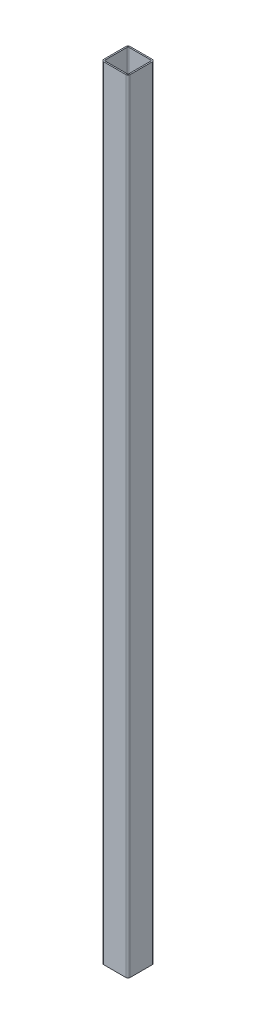
ISO-10303-21;
HEADER;
FILE_DESCRIPTION(('STEP AP214'),'2;1');
FILE_NAME('part.step','',(''),(''),'','','');
FILE_SCHEMA(('AUTOMOTIVE_DESIGN { 1 0 10303 214 1 1 1 1 }'));
ENDSEC;
DATA;
#1=APPLICATION_CONTEXT('core data for automotive mechanical design processes');
#2=APPLICATION_PROTOCOL_DEFINITION('international standard','automotive_design',2000,#1);
#3=PRODUCT_CONTEXT('',#1,'mechanical');
#4=PRODUCT('Part','Part','',(#3));
#5=PRODUCT_RELATED_PRODUCT_CATEGORY('part','',(#4));
#6=PRODUCT_DEFINITION_FORMATION('','',#4);
#7=PRODUCT_DEFINITION_CONTEXT('part definition',#1,'design');
#8=PRODUCT_DEFINITION('design','',#6,#7);
#9=PRODUCT_DEFINITION_SHAPE('','',#8);
#10=(LENGTH_UNIT() NAMED_UNIT(*) SI_UNIT(.MILLI.,.METRE.));
#11=(NAMED_UNIT(*) PLANE_ANGLE_UNIT() SI_UNIT($,.RADIAN.));
#12=(NAMED_UNIT(*) SI_UNIT($,.STERADIAN.) SOLID_ANGLE_UNIT());
#13=UNCERTAINTY_MEASURE_WITH_UNIT(LENGTH_MEASURE(1.E-05),#10,'distance_accuracy_value','');
#14=(GEOMETRIC_REPRESENTATION_CONTEXT(3) GLOBAL_UNCERTAINTY_ASSIGNED_CONTEXT((#13)) GLOBAL_UNIT_ASSIGNED_CONTEXT((#10,
#11,#12)) REPRESENTATION_CONTEXT('',''));
#15=CARTESIAN_POINT('',(0.,0.,0.));
#16=DIRECTION('',(0.,0.,1.));
#17=DIRECTION('',(1.,0.,0.));
#18=AXIS2_PLACEMENT_3D('',#15,#16,#17);
#19=CARTESIAN_POINT('',(25.,-1143.,25.));
#20=DIRECTION('',(0.,1.,0.));
#21=DIRECTION('',(0.,0.,1.));
#22=AXIS2_PLACEMENT_3D('',#19,#20,#21);
#23=CYLINDRICAL_SURFACE('',#22,5.);
#24=DIRECTION('',(0.,1.,0.));
#25=VECTOR('',#24,1.);
#26=CARTESIAN_POINT('',(30.,-1143.,25.));
#27=LINE('',#26,#25);
#28=CARTESIAN_POINT('',(30.,-1143.,25.));
#29=VERTEX_POINT('',#28);
#30=CARTESIAN_POINT('',(30.,630.,25.));
#31=VERTEX_POINT('',#30);
#32=EDGE_CURVE('E132',#29,#31,#27,.T.);
#33=ORIENTED_EDGE('',*,*,#32,.T.);
#34=CARTESIAN_POINT('',(25.,630.,25.));
#35=DIRECTION('',(0.,1.,0.));
#36=DIRECTION('',(0.,0.,-1.));
#37=AXIS2_PLACEMENT_3D('',#34,#35,#36);
#38=CIRCLE('',#37,5.);
#39=CARTESIAN_POINT('',(25.,630.,30.));
#40=VERTEX_POINT('',#39);
#41=EDGE_CURVE('E285',#40,#31,#38,.T.);
#42=ORIENTED_EDGE('',*,*,#41,.F.);
#43=DIRECTION('',(0.,1.,0.));
#44=VECTOR('',#43,1.);
#45=CARTESIAN_POINT('',(25.,-1143.,30.));
#46=LINE('',#45,#44);
#47=CARTESIAN_POINT('',(25.,-1143.,30.));
#48=VERTEX_POINT('',#47);
#49=EDGE_CURVE('E12',#48,#40,#46,.T.);
#50=ORIENTED_EDGE('',*,*,#49,.F.);
#51=CARTESIAN_POINT('',(25.,-1143.,25.));
#52=DIRECTION('',(0.,1.,0.));
#53=DIRECTION('',(0.,0.,-1.));
#54=AXIS2_PLACEMENT_3D('',#51,#52,#53);
#55=CIRCLE('',#54,5.);
#56=EDGE_CURVE('E328',#48,#29,#55,.T.);
#57=ORIENTED_EDGE('',*,*,#56,.T.);
#58=EDGE_LOOP('',(#33,#42,#50,#57));
#59=FACE_BOUND('',#58,.T.);
#60=ADVANCED_FACE('F129',(#59),#23,.T.);
#61=CARTESIAN_POINT('',(-25.,-1143.,30.));
#62=DIRECTION('',(0.,0.,1.));
#63=DIRECTION('',(1.,0.,0.));
#64=AXIS2_PLACEMENT_3D('',#61,#62,#63);
#65=PLANE('',#64);
#66=ORIENTED_EDGE('',*,*,#49,.T.);
#67=DIRECTION('',(1.,0.,0.));
#68=VECTOR('',#67,1.);
#69=CARTESIAN_POINT('',(-25.,630.,30.));
#70=LINE('',#69,#68);
#71=CARTESIAN_POINT('',(-25.,630.,30.));
#72=VERTEX_POINT('',#71);
#73=EDGE_CURVE('E306',#72,#40,#70,.T.);
#74=ORIENTED_EDGE('',*,*,#73,.F.);
#75=DIRECTION('',(0.,1.,0.));
#76=VECTOR('',#75,1.);
#77=CARTESIAN_POINT('',(-25.,-1143.,30.));
#78=LINE('',#77,#76);
#79=CARTESIAN_POINT('',(-25.,-1143.,30.));
#80=VERTEX_POINT('',#79);
#81=EDGE_CURVE('E137',#80,#72,#78,.T.);
#82=ORIENTED_EDGE('',*,*,#81,.F.);
#83=DIRECTION('',(1.,0.,0.));
#84=VECTOR('',#83,1.);
#85=CARTESIAN_POINT('',(-25.,-1143.,30.));
#86=LINE('',#85,#84);
#87=EDGE_CURVE('E359',#80,#48,#86,.T.);
#88=ORIENTED_EDGE('',*,*,#87,.T.);
#89=EDGE_LOOP('',(#66,#74,#82,#88));
#90=FACE_BOUND('',#89,.T.);
#91=ADVANCED_FACE('F380',(#90),#65,.T.);
#92=CARTESIAN_POINT('',(-25.,-1143.,25.));
#93=DIRECTION('',(0.,1.,0.));
#94=DIRECTION('',(0.,0.,1.));
#95=AXIS2_PLACEMENT_3D('',#92,#93,#94);
#96=CYLINDRICAL_SURFACE('',#95,5.00000000000001);
#97=ORIENTED_EDGE('',*,*,#81,.T.);
#98=CARTESIAN_POINT('',(-25.,630.,25.));
#99=DIRECTION('',(0.,1.,0.));
#100=DIRECTION('',(0.,0.,-1.));
#101=AXIS2_PLACEMENT_3D('',#98,#99,#100);
#102=CIRCLE('',#101,5.00000000000001);
#103=CARTESIAN_POINT('',(-30.,630.,25.));
#104=VERTEX_POINT('',#103);
#105=EDGE_CURVE('E303',#104,#72,#102,.T.);
#106=ORIENTED_EDGE('',*,*,#105,.F.);
#107=DIRECTION('',(0.,1.,0.));
#108=VECTOR('',#107,1.);
#109=CARTESIAN_POINT('',(-30.,-1143.,25.));
#110=LINE('',#109,#108);
#111=CARTESIAN_POINT('',(-30.,-1143.,25.));
#112=VERTEX_POINT('',#111);
#113=EDGE_CURVE('E363',#112,#104,#110,.T.);
#114=ORIENTED_EDGE('',*,*,#113,.F.);
#115=CARTESIAN_POINT('',(-25.,-1143.,25.));
#116=DIRECTION('',(0.,1.,0.));
#117=DIRECTION('',(0.,0.,-1.));
#118=AXIS2_PLACEMENT_3D('',#115,#116,#117);
#119=CIRCLE('',#118,5.00000000000001);
#120=EDGE_CURVE('E356',#112,#80,#119,.T.);
#121=ORIENTED_EDGE('',*,*,#120,.T.);
#122=EDGE_LOOP('',(#97,#106,#114,#121));
#123=FACE_BOUND('',#122,.T.);
#124=ADVANCED_FACE('F401',(#123),#96,.T.);
#125=CARTESIAN_POINT('',(-30.,-1143.,-25.));
#126=DIRECTION('',(-1.,0.,0.));
#127=DIRECTION('',(0.,0.,1.));
#128=AXIS2_PLACEMENT_3D('',#125,#126,#127);
#129=PLANE('',#128);
#130=ORIENTED_EDGE('',*,*,#113,.T.);
#131=DIRECTION('',(0.,0.,1.));
#132=VECTOR('',#131,1.);
#133=CARTESIAN_POINT('',(-30.,630.,-25.));
#134=LINE('',#133,#132);
#135=CARTESIAN_POINT('',(-30.,630.,-25.));
#136=VERTEX_POINT('',#135);
#137=EDGE_CURVE('E300',#136,#104,#134,.T.);
#138=ORIENTED_EDGE('',*,*,#137,.F.);
#139=DIRECTION('',(0.,1.,0.));
#140=VECTOR('',#139,1.);
#141=CARTESIAN_POINT('',(-30.,-1143.,-25.));
#142=LINE('',#141,#140);
#143=CARTESIAN_POINT('',(-30.,-1143.,-25.));
#144=VERTEX_POINT('',#143);
#145=EDGE_CURVE('E365',#144,#136,#142,.T.);
#146=ORIENTED_EDGE('',*,*,#145,.F.);
#147=DIRECTION('',(0.,0.,1.));
#148=VECTOR('',#147,1.);
#149=CARTESIAN_POINT('',(-30.,-1143.,-25.));
#150=LINE('',#149,#148);
#151=EDGE_CURVE('E353',#144,#112,#150,.T.);
#152=ORIENTED_EDGE('',*,*,#151,.T.);
#153=EDGE_LOOP('',(#130,#138,#146,#152));
#154=FACE_BOUND('',#153,.T.);
#155=ADVANCED_FACE('F398',(#154),#129,.T.);
#156=CARTESIAN_POINT('',(-25.,-1143.,-25.));
#157=DIRECTION('',(0.,1.,0.));
#158=DIRECTION('',(0.,0.,1.));
#159=AXIS2_PLACEMENT_3D('',#156,#157,#158);
#160=CYLINDRICAL_SURFACE('',#159,5.);
#161=ORIENTED_EDGE('',*,*,#145,.T.);
#162=CARTESIAN_POINT('',(-25.,630.,-25.));
#163=DIRECTION('',(0.,1.,0.));
#164=DIRECTION('',(0.,0.,1.));
#165=AXIS2_PLACEMENT_3D('',#162,#163,#164);
#166=CIRCLE('',#165,5.);
#167=CARTESIAN_POINT('',(-25.,630.,-30.));
#168=VERTEX_POINT('',#167);
#169=EDGE_CURVE('E297',#168,#136,#166,.T.);
#170=ORIENTED_EDGE('',*,*,#169,.F.);
#171=DIRECTION('',(0.,1.,0.));
#172=VECTOR('',#171,1.);
#173=CARTESIAN_POINT('',(-25.,-1143.,-30.));
#174=LINE('',#173,#172);
#175=CARTESIAN_POINT('',(-25.,-1143.,-30.));
#176=VERTEX_POINT('',#175);
#177=EDGE_CURVE('E367',#176,#168,#174,.T.);
#178=ORIENTED_EDGE('',*,*,#177,.F.);
#179=CARTESIAN_POINT('',(-25.,-1143.,-25.));
#180=DIRECTION('',(0.,1.,0.));
#181=DIRECTION('',(0.,0.,1.));
#182=AXIS2_PLACEMENT_3D('',#179,#180,#181);
#183=CIRCLE('',#182,5.);
#184=EDGE_CURVE('E350',#176,#144,#183,.T.);
#185=ORIENTED_EDGE('',*,*,#184,.T.);
#186=EDGE_LOOP('',(#161,#170,#178,#185));
#187=FACE_BOUND('',#186,.T.);
#188=ADVANCED_FACE('F396',(#187),#160,.T.);
#189=CARTESIAN_POINT('',(-25.,-1143.,-30.));
#190=DIRECTION('',(0.,0.,-1.));
#191=DIRECTION('',(-1.,0.,0.));
#192=AXIS2_PLACEMENT_3D('',#189,#190,#191);
#193=PLANE('',#192);
#194=ORIENTED_EDGE('',*,*,#177,.T.);
#195=DIRECTION('',(-1.,0.,0.));
#196=VECTOR('',#195,1.);
#197=CARTESIAN_POINT('',(-25.,630.,-30.));
#198=LINE('',#197,#196);
#199=CARTESIAN_POINT('',(25.,630.,-30.));
#200=VERTEX_POINT('',#199);
#201=EDGE_CURVE('E294',#200,#168,#198,.T.);
#202=ORIENTED_EDGE('',*,*,#201,.F.);
#203=DIRECTION('',(0.,1.,0.));
#204=VECTOR('',#203,1.);
#205=CARTESIAN_POINT('',(25.,-1143.,-30.));
#206=LINE('',#205,#204);
#207=CARTESIAN_POINT('',(25.,-1143.,-30.));
#208=VERTEX_POINT('',#207);
#209=EDGE_CURVE('E369',#208,#200,#206,.T.);
#210=ORIENTED_EDGE('',*,*,#209,.F.);
#211=DIRECTION('',(-1.,0.,0.));
#212=VECTOR('',#211,1.);
#213=CARTESIAN_POINT('',(-25.,-1143.,-30.));
#214=LINE('',#213,#212);
#215=EDGE_CURVE('E347',#208,#176,#214,.T.);
#216=ORIENTED_EDGE('',*,*,#215,.T.);
#217=EDGE_LOOP('',(#194,#202,#210,#216));
#218=FACE_BOUND('',#217,.T.);
#219=ADVANCED_FACE('F394',(#218),#193,.T.);
#220=CARTESIAN_POINT('',(25.,-1143.,-25.));
#221=DIRECTION('',(0.,1.,0.));
#222=DIRECTION('',(0.,0.,1.));
#223=AXIS2_PLACEMENT_3D('',#220,#221,#222);
#224=CYLINDRICAL_SURFACE('',#223,5.);
#225=ORIENTED_EDGE('',*,*,#209,.T.);
#226=CARTESIAN_POINT('',(25.,630.,-25.));
#227=DIRECTION('',(0.,1.,0.));
#228=DIRECTION('',(0.,0.,-1.));
#229=AXIS2_PLACEMENT_3D('',#226,#227,#228);
#230=CIRCLE('',#229,5.);
#231=CARTESIAN_POINT('',(30.,630.,-25.));
#232=VERTEX_POINT('',#231);
#233=EDGE_CURVE('E291',#232,#200,#230,.T.);
#234=ORIENTED_EDGE('',*,*,#233,.F.);
#235=DIRECTION('',(0.,1.,0.));
#236=VECTOR('',#235,1.);
#237=CARTESIAN_POINT('',(30.,-1143.,-25.));
#238=LINE('',#237,#236);
#239=CARTESIAN_POINT('',(30.,-1143.,-25.));
#240=VERTEX_POINT('',#239);
#241=EDGE_CURVE('E370',#240,#232,#238,.T.);
#242=ORIENTED_EDGE('',*,*,#241,.F.);
#243=CARTESIAN_POINT('',(25.,-1143.,-25.));
#244=DIRECTION('',(0.,1.,0.));
#245=DIRECTION('',(0.,0.,-1.));
#246=AXIS2_PLACEMENT_3D('',#243,#244,#245);
#247=CIRCLE('',#246,5.);
#248=EDGE_CURVE('E344',#240,#208,#247,.T.);
#249=ORIENTED_EDGE('',*,*,#248,.T.);
#250=EDGE_LOOP('',(#225,#234,#242,#249));
#251=FACE_BOUND('',#250,.T.);
#252=ADVANCED_FACE('F390',(#251),#224,.T.);
#253=CARTESIAN_POINT('',(30.,-1143.,-25.));
#254=DIRECTION('',(1.,0.,0.));
#255=DIRECTION('',(0.,0.,-1.));
#256=AXIS2_PLACEMENT_3D('',#253,#254,#255);
#257=PLANE('',#256);
#258=ORIENTED_EDGE('',*,*,#241,.T.);
#259=DIRECTION('',(0.,0.,-1.));
#260=VECTOR('',#259,1.);
#261=CARTESIAN_POINT('',(30.,630.,-25.));
#262=LINE('',#261,#260);
#263=EDGE_CURVE('E288',#31,#232,#262,.T.);
#264=ORIENTED_EDGE('',*,*,#263,.F.);
#265=ORIENTED_EDGE('',*,*,#32,.F.);
#266=DIRECTION('',(0.,0.,-1.));
#267=VECTOR('',#266,1.);
#268=CARTESIAN_POINT('',(30.,-1143.,-25.));
#269=LINE('',#268,#267);
#270=EDGE_CURVE('E341',#29,#240,#269,.T.);
#271=ORIENTED_EDGE('',*,*,#270,.T.);
#272=EDGE_LOOP('',(#258,#264,#265,#271));
#273=FACE_BOUND('',#272,.T.);
#274=ADVANCED_FACE('F374',(#273),#257,.T.);
#275=CARTESIAN_POINT('',(25.,-1143.,25.));
#276=DIRECTION('',(0.,1.,0.));
#277=DIRECTION('',(0.,0.,1.));
#278=AXIS2_PLACEMENT_3D('',#275,#276,#277);
#279=PLANE('',#278);
#280=DIRECTION('',(1.,0.,0.));
#281=VECTOR('',#280,1.);
#282=CARTESIAN_POINT('',(25.,-1143.,27.));
#283=LINE('',#282,#281);
#284=CARTESIAN_POINT('',(-25.,-1143.,27.));
#285=VERTEX_POINT('',#284);
#286=CARTESIAN_POINT('',(25.,-1143.,27.));
#287=VERTEX_POINT('',#286);
#288=EDGE_CURVE('E254',#285,#287,#283,.T.);
#289=ORIENTED_EDGE('',*,*,#288,.T.);
#290=CARTESIAN_POINT('',(25.,-1143.,25.));
#291=DIRECTION('',(0.,-1.,0.));
#292=DIRECTION('',(-1.,0.,0.));
#293=AXIS2_PLACEMENT_3D('',#290,#291,#292);
#294=CIRCLE('',#293,2.);
#295=CARTESIAN_POINT('',(27.,-1143.,25.));
#296=VERTEX_POINT('',#295);
#297=EDGE_CURVE('E309',#287,#296,#294,.F.);
#298=ORIENTED_EDGE('',*,*,#297,.T.);
#299=DIRECTION('',(0.,0.,-1.));
#300=VECTOR('',#299,1.);
#301=CARTESIAN_POINT('',(27.,-1143.,25.));
#302=LINE('',#301,#300);
#303=CARTESIAN_POINT('',(27.,-1143.,-25.));
#304=VERTEX_POINT('',#303);
#305=EDGE_CURVE('E249',#296,#304,#302,.T.);
#306=ORIENTED_EDGE('',*,*,#305,.T.);
#307=CARTESIAN_POINT('',(25.,-1143.,-25.));
#308=DIRECTION('',(0.,-1.,0.));
#309=DIRECTION('',(-1.,0.,0.));
#310=AXIS2_PLACEMENT_3D('',#307,#308,#309);
#311=CIRCLE('',#310,2.);
#312=CARTESIAN_POINT('',(25.,-1143.,-27.));
#313=VERTEX_POINT('',#312);
#314=EDGE_CURVE('E145',#304,#313,#311,.F.);
#315=ORIENTED_EDGE('',*,*,#314,.T.);
#316=DIRECTION('',(-1.,0.,0.));
#317=VECTOR('',#316,1.);
#318=CARTESIAN_POINT('',(25.,-1143.,-27.));
#319=LINE('',#318,#317);
#320=CARTESIAN_POINT('',(-25.,-1143.,-27.));
#321=VERTEX_POINT('',#320);
#322=EDGE_CURVE('E313',#313,#321,#319,.T.);
#323=ORIENTED_EDGE('',*,*,#322,.T.);
#324=CARTESIAN_POINT('',(-25.,-1143.,-25.));
#325=DIRECTION('',(0.,-1.,0.));
#326=DIRECTION('',(-1.,0.,0.));
#327=AXIS2_PLACEMENT_3D('',#324,#325,#326);
#328=CIRCLE('',#327,2.);
#329=CARTESIAN_POINT('',(-27.,-1143.,-25.));
#330=VERTEX_POINT('',#329);
#331=EDGE_CURVE('E316',#321,#330,#328,.F.);
#332=ORIENTED_EDGE('',*,*,#331,.T.);
#333=DIRECTION('',(0.,0.,1.));
#334=VECTOR('',#333,1.);
#335=CARTESIAN_POINT('',(-27.,-1143.,25.));
#336=LINE('',#335,#334);
#337=CARTESIAN_POINT('',(-27.,-1143.,25.));
#338=VERTEX_POINT('',#337);
#339=EDGE_CURVE('E319',#330,#338,#336,.T.);
#340=ORIENTED_EDGE('',*,*,#339,.T.);
#341=CARTESIAN_POINT('',(-25.,-1143.,25.));
#342=DIRECTION('',(0.,-1.,0.));
#343=DIRECTION('',(-1.,0.,0.));
#344=AXIS2_PLACEMENT_3D('',#341,#342,#343);
#345=CIRCLE('',#344,2.00000000000001);
#346=EDGE_CURVE('E322',#338,#285,#345,.F.);
#347=ORIENTED_EDGE('',*,*,#346,.T.);
#348=EDGE_LOOP('',(#289,#298,#306,#315,#323,#332,#340,#347));
#349=FACE_BOUND('',#348,.T.);
#350=ORIENTED_EDGE('',*,*,#56,.F.);
#351=ORIENTED_EDGE('',*,*,#87,.F.);
#352=ORIENTED_EDGE('',*,*,#120,.F.);
#353=ORIENTED_EDGE('',*,*,#151,.F.);
#354=ORIENTED_EDGE('',*,*,#184,.F.);
#355=ORIENTED_EDGE('',*,*,#215,.F.);
#356=ORIENTED_EDGE('',*,*,#248,.F.);
#357=ORIENTED_EDGE('',*,*,#270,.F.);
#358=EDGE_LOOP('',(#350,#351,#352,#353,#354,#355,#356,#357));
#359=FACE_BOUND('',#358,.T.);
#360=ADVANCED_FACE('F384',(#349,#359),#279,.F.);
#361=CARTESIAN_POINT('',(25.,-1143.,25.));
#362=DIRECTION('',(0.,1.,0.));
#363=DIRECTION('',(0.,0.,1.));
#364=AXIS2_PLACEMENT_3D('',#361,#362,#363);
#365=CYLINDRICAL_SURFACE('',#364,2.);
#366=DIRECTION('',(0.,1.,0.));
#367=VECTOR('',#366,1.);
#368=CARTESIAN_POINT('',(25.,-1143.,27.));
#369=LINE('',#368,#367);
#370=CARTESIAN_POINT('',(25.,630.,27.));
#371=VERTEX_POINT('',#370);
#372=EDGE_CURVE('E259',#287,#371,#369,.T.);
#373=ORIENTED_EDGE('',*,*,#372,.T.);
#374=CARTESIAN_POINT('',(25.,630.,25.));
#375=DIRECTION('',(0.,-1.,0.));
#376=DIRECTION('',(-1.,0.,0.));
#377=AXIS2_PLACEMENT_3D('',#374,#375,#376);
#378=CIRCLE('',#377,2.);
#379=CARTESIAN_POINT('',(27.,630.,25.));
#380=VERTEX_POINT('',#379);
#381=EDGE_CURVE('E257',#371,#380,#378,.F.);
#382=ORIENTED_EDGE('',*,*,#381,.T.);
#383=DIRECTION('',(0.,1.,0.));
#384=VECTOR('',#383,1.);
#385=CARTESIAN_POINT('',(27.,-1143.,25.));
#386=LINE('',#385,#384);
#387=EDGE_CURVE('E242',#296,#380,#386,.T.);
#388=ORIENTED_EDGE('',*,*,#387,.F.);
#389=ORIENTED_EDGE('',*,*,#297,.F.);
#390=EDGE_LOOP('',(#373,#382,#388,#389));
#391=FACE_BOUND('',#390,.T.);
#392=ADVANCED_FACE('F258',(#391),#365,.F.);
#393=CARTESIAN_POINT('',(25.,-1143.,27.));
#394=DIRECTION('',(0.,0.,1.));
#395=DIRECTION('',(1.,0.,0.));
#396=AXIS2_PLACEMENT_3D('',#393,#394,#395);
#397=PLANE('',#396);
#398=DIRECTION('',(0.,1.,0.));
#399=VECTOR('',#398,1.);
#400=CARTESIAN_POINT('',(-25.,-1143.,27.));
#401=LINE('',#400,#399);
#402=CARTESIAN_POINT('',(-25.,630.,27.));
#403=VERTEX_POINT('',#402);
#404=EDGE_CURVE('E329',#285,#403,#401,.T.);
#405=ORIENTED_EDGE('',*,*,#404,.T.);
#406=DIRECTION('',(1.,0.,0.));
#407=VECTOR('',#406,1.);
#408=CARTESIAN_POINT('',(25.,630.,27.));
#409=LINE('',#408,#407);
#410=EDGE_CURVE('E283',#403,#371,#409,.T.);
#411=ORIENTED_EDGE('',*,*,#410,.T.);
#412=ORIENTED_EDGE('',*,*,#372,.F.);
#413=ORIENTED_EDGE('',*,*,#288,.F.);
#414=EDGE_LOOP('',(#405,#411,#412,#413));
#415=FACE_BOUND('',#414,.T.);
#416=ADVANCED_FACE('F476',(#415),#397,.F.);
#417=CARTESIAN_POINT('',(-25.,-1143.,25.));
#418=DIRECTION('',(0.,1.,0.));
#419=DIRECTION('',(0.,0.,1.));
#420=AXIS2_PLACEMENT_3D('',#417,#418,#419);
#421=CYLINDRICAL_SURFACE('',#420,2.00000000000001);
#422=DIRECTION('',(0.,1.,0.));
#423=VECTOR('',#422,1.);
#424=CARTESIAN_POINT('',(-27.,-1143.,25.));
#425=LINE('',#424,#423);
#426=CARTESIAN_POINT('',(-27.,630.,25.));
#427=VERTEX_POINT('',#426);
#428=EDGE_CURVE('E331',#338,#427,#425,.T.);
#429=ORIENTED_EDGE('',*,*,#428,.T.);
#430=CARTESIAN_POINT('',(-25.,630.,25.));
#431=DIRECTION('',(0.,-1.,0.));
#432=DIRECTION('',(-1.,0.,0.));
#433=AXIS2_PLACEMENT_3D('',#430,#431,#432);
#434=CIRCLE('',#433,2.00000000000001);
#435=EDGE_CURVE('E280',#427,#403,#434,.F.);
#436=ORIENTED_EDGE('',*,*,#435,.T.);
#437=ORIENTED_EDGE('',*,*,#404,.F.);
#438=ORIENTED_EDGE('',*,*,#346,.F.);
#439=EDGE_LOOP('',(#429,#436,#437,#438));
#440=FACE_BOUND('',#439,.T.);
#441=ADVANCED_FACE('F485',(#440),#421,.F.);
#442=CARTESIAN_POINT('',(-27.,-1143.,25.));
#443=DIRECTION('',(-1.,0.,0.));
#444=DIRECTION('',(0.,0.,1.));
#445=AXIS2_PLACEMENT_3D('',#442,#443,#444);
#446=PLANE('',#445);
#447=DIRECTION('',(0.,1.,0.));
#448=VECTOR('',#447,1.);
#449=CARTESIAN_POINT('',(-27.,-1143.,-25.));
#450=LINE('',#449,#448);
#451=CARTESIAN_POINT('',(-27.,630.,-25.));
#452=VERTEX_POINT('',#451);
#453=EDGE_CURVE('E333',#330,#452,#450,.T.);
#454=ORIENTED_EDGE('',*,*,#453,.T.);
#455=DIRECTION('',(0.,0.,1.));
#456=VECTOR('',#455,1.);
#457=CARTESIAN_POINT('',(-27.,630.,25.));
#458=LINE('',#457,#456);
#459=EDGE_CURVE('E277',#452,#427,#458,.T.);
#460=ORIENTED_EDGE('',*,*,#459,.T.);
#461=ORIENTED_EDGE('',*,*,#428,.F.);
#462=ORIENTED_EDGE('',*,*,#339,.F.);
#463=EDGE_LOOP('',(#454,#460,#461,#462));
#464=FACE_BOUND('',#463,.T.);
#465=ADVANCED_FACE('F495',(#464),#446,.F.);
#466=CARTESIAN_POINT('',(-25.,-1143.,-25.));
#467=DIRECTION('',(0.,1.,0.));
#468=DIRECTION('',(0.,0.,1.));
#469=AXIS2_PLACEMENT_3D('',#466,#467,#468);
#470=CYLINDRICAL_SURFACE('',#469,2.);
#471=DIRECTION('',(0.,1.,0.));
#472=VECTOR('',#471,1.);
#473=CARTESIAN_POINT('',(-25.,-1143.,-27.));
#474=LINE('',#473,#472);
#475=CARTESIAN_POINT('',(-25.,630.,-27.));
#476=VERTEX_POINT('',#475);
#477=EDGE_CURVE('E335',#321,#476,#474,.T.);
#478=ORIENTED_EDGE('',*,*,#477,.T.);
#479=CARTESIAN_POINT('',(-25.,630.,-25.));
#480=DIRECTION('',(0.,-1.,0.));
#481=DIRECTION('',(-1.,0.,0.));
#482=AXIS2_PLACEMENT_3D('',#479,#480,#481);
#483=CIRCLE('',#482,2.);
#484=EDGE_CURVE('E274',#476,#452,#483,.F.);
#485=ORIENTED_EDGE('',*,*,#484,.T.);
#486=ORIENTED_EDGE('',*,*,#453,.F.);
#487=ORIENTED_EDGE('',*,*,#331,.F.);
#488=EDGE_LOOP('',(#478,#485,#486,#487));
#489=FACE_BOUND('',#488,.T.);
#490=ADVANCED_FACE('F505',(#489),#470,.F.);
#491=CARTESIAN_POINT('',(25.,-1143.,-27.));
#492=DIRECTION('',(0.,0.,-1.));
#493=DIRECTION('',(-1.,0.,0.));
#494=AXIS2_PLACEMENT_3D('',#491,#492,#493);
#495=PLANE('',#494);
#496=DIRECTION('',(0.,1.,0.));
#497=VECTOR('',#496,1.);
#498=CARTESIAN_POINT('',(25.,-1143.,-27.));
#499=LINE('',#498,#497);
#500=CARTESIAN_POINT('',(25.,630.,-27.));
#501=VERTEX_POINT('',#500);
#502=EDGE_CURVE('E337',#313,#501,#499,.T.);
#503=ORIENTED_EDGE('',*,*,#502,.T.);
#504=DIRECTION('',(-1.,0.,0.));
#505=VECTOR('',#504,1.);
#506=CARTESIAN_POINT('',(25.,630.,-27.));
#507=LINE('',#506,#505);
#508=EDGE_CURVE('E269',#501,#476,#507,.T.);
#509=ORIENTED_EDGE('',*,*,#508,.T.);
#510=ORIENTED_EDGE('',*,*,#477,.F.);
#511=ORIENTED_EDGE('',*,*,#322,.F.);
#512=EDGE_LOOP('',(#503,#509,#510,#511));
#513=FACE_BOUND('',#512,.T.);
#514=ADVANCED_FACE('F515',(#513),#495,.F.);
#515=CARTESIAN_POINT('',(25.,-1143.,-25.));
#516=DIRECTION('',(0.,1.,0.));
#517=DIRECTION('',(0.,0.,1.));
#518=AXIS2_PLACEMENT_3D('',#515,#516,#517);
#519=CYLINDRICAL_SURFACE('',#518,2.);
#520=DIRECTION('',(0.,1.,0.));
#521=VECTOR('',#520,1.);
#522=CARTESIAN_POINT('',(27.,-1143.,-25.));
#523=LINE('',#522,#521);
#524=CARTESIAN_POINT('',(27.,630.,-25.));
#525=VERTEX_POINT('',#524);
#526=EDGE_CURVE('E253',#304,#525,#523,.T.);
#527=ORIENTED_EDGE('',*,*,#526,.T.);
#528=CARTESIAN_POINT('',(25.,630.,-25.));
#529=DIRECTION('',(0.,-1.,0.));
#530=DIRECTION('',(-1.,0.,0.));
#531=AXIS2_PLACEMENT_3D('',#528,#529,#530);
#532=CIRCLE('',#531,2.);
#533=EDGE_CURVE('E267',#525,#501,#532,.F.);
#534=ORIENTED_EDGE('',*,*,#533,.T.);
#535=ORIENTED_EDGE('',*,*,#502,.F.);
#536=ORIENTED_EDGE('',*,*,#314,.F.);
#537=EDGE_LOOP('',(#527,#534,#535,#536));
#538=FACE_BOUND('',#537,.T.);
#539=ADVANCED_FACE('F525',(#538),#519,.F.);
#540=CARTESIAN_POINT('',(27.,-1143.,25.));
#541=DIRECTION('',(1.,0.,0.));
#542=DIRECTION('',(0.,0.,-1.));
#543=AXIS2_PLACEMENT_3D('',#540,#541,#542);
#544=PLANE('',#543);
#545=ORIENTED_EDGE('',*,*,#387,.T.);
#546=DIRECTION('',(0.,0.,-1.));
#547=VECTOR('',#546,1.);
#548=CARTESIAN_POINT('',(27.,630.,25.));
#549=LINE('',#548,#547);
#550=EDGE_CURVE('E246',#380,#525,#549,.T.);
#551=ORIENTED_EDGE('',*,*,#550,.T.);
#552=ORIENTED_EDGE('',*,*,#526,.F.);
#553=ORIENTED_EDGE('',*,*,#305,.F.);
#554=EDGE_LOOP('',(#545,#551,#552,#553));
#555=FACE_BOUND('',#554,.T.);
#556=ADVANCED_FACE('F244',(#555),#544,.F.);
#557=CARTESIAN_POINT('',(25.,630.,25.));
#558=DIRECTION('',(0.,1.,0.));
#559=DIRECTION('',(0.,0.,1.));
#560=AXIS2_PLACEMENT_3D('',#557,#558,#559);
#561=PLANE('',#560);
#562=ORIENTED_EDGE('',*,*,#41,.T.);
#563=ORIENTED_EDGE('',*,*,#263,.T.);
#564=ORIENTED_EDGE('',*,*,#233,.T.);
#565=ORIENTED_EDGE('',*,*,#201,.T.);
#566=ORIENTED_EDGE('',*,*,#169,.T.);
#567=ORIENTED_EDGE('',*,*,#137,.T.);
#568=ORIENTED_EDGE('',*,*,#105,.T.);
#569=ORIENTED_EDGE('',*,*,#73,.T.);
#570=EDGE_LOOP('',(#562,#563,#564,#565,#566,#567,#568,#569));
#571=FACE_BOUND('',#570,.T.);
#572=ORIENTED_EDGE('',*,*,#550,.F.);
#573=ORIENTED_EDGE('',*,*,#381,.F.);
#574=ORIENTED_EDGE('',*,*,#410,.F.);
#575=ORIENTED_EDGE('',*,*,#435,.F.);
#576=ORIENTED_EDGE('',*,*,#459,.F.);
#577=ORIENTED_EDGE('',*,*,#484,.F.);
#578=ORIENTED_EDGE('',*,*,#508,.F.);
#579=ORIENTED_EDGE('',*,*,#533,.F.);
#580=EDGE_LOOP('',(#572,#573,#574,#575,#576,#577,#578,#579));
#581=FACE_BOUND('',#580,.T.);
#582=ADVANCED_FACE('F264',(#571,#581),#561,.T.);
#583=CLOSED_SHELL('',(#60,#91,#124,#155,#188,#219,#252,#274,#360,#392,#416,#441,#465,#490,#514,
#539,#556,#582));
#584=MANIFOLD_SOLID_BREP('B2',#583);
#585=ADVANCED_BREP_SHAPE_REPRESENTATION('',(#18,#584),#14);
#586=SHAPE_DEFINITION_REPRESENTATION(#9,#585);
ENDSEC;
END-ISO-10303-21;
